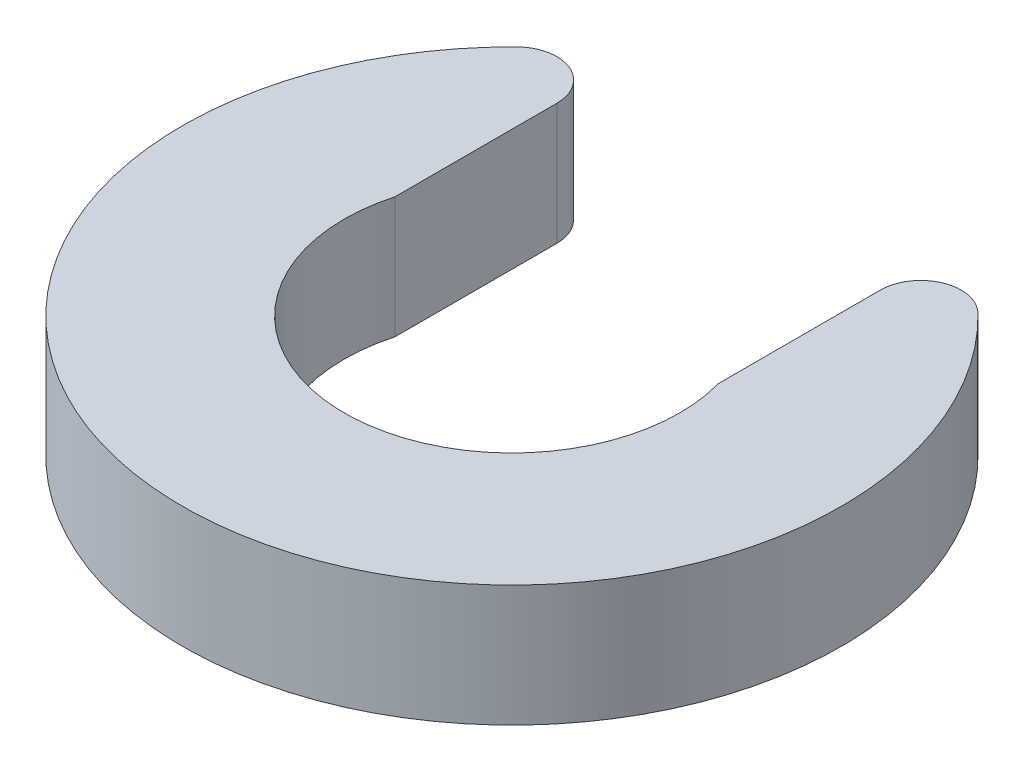
ISO-10303-21;
HEADER;
FILE_DESCRIPTION(('STEP AP214'),'2;1');
FILE_NAME('part.step','',(''),(''),'','','');
FILE_SCHEMA(('AUTOMOTIVE_DESIGN { 1 0 10303 214 1 1 1 1 }'));
ENDSEC;
DATA;
#1=APPLICATION_CONTEXT('core data for automotive mechanical design processes');
#2=APPLICATION_PROTOCOL_DEFINITION('international standard','automotive_design',2000,#1);
#3=PRODUCT_CONTEXT('',#1,'mechanical');
#4=PRODUCT('Part','Part','',(#3));
#5=PRODUCT_RELATED_PRODUCT_CATEGORY('part','',(#4));
#6=PRODUCT_DEFINITION_FORMATION('','',#4);
#7=PRODUCT_DEFINITION_CONTEXT('part definition',#1,'design');
#8=PRODUCT_DEFINITION('design','',#6,#7);
#9=PRODUCT_DEFINITION_SHAPE('','',#8);
#10=(LENGTH_UNIT() NAMED_UNIT(*) SI_UNIT(.MILLI.,.METRE.));
#11=(NAMED_UNIT(*) PLANE_ANGLE_UNIT() SI_UNIT($,.RADIAN.));
#12=(NAMED_UNIT(*) SI_UNIT($,.STERADIAN.) SOLID_ANGLE_UNIT());
#13=UNCERTAINTY_MEASURE_WITH_UNIT(LENGTH_MEASURE(1.E-05),#10,'distance_accuracy_value','');
#14=(GEOMETRIC_REPRESENTATION_CONTEXT(3) GLOBAL_UNCERTAINTY_ASSIGNED_CONTEXT((#13)) GLOBAL_UNIT_ASSIGNED_CONTEXT((#10,
#11,#12)) REPRESENTATION_CONTEXT('',''));
#15=CARTESIAN_POINT('',(0.,0.,0.));
#16=DIRECTION('',(0.,0.,1.));
#17=DIRECTION('',(1.,0.,0.));
#18=AXIS2_PLACEMENT_3D('',#15,#16,#17);
#19=CARTESIAN_POINT('',(-4.,3.,0.));
#20=DIRECTION('',(1.,0.,0.));
#21=DIRECTION('',(0.,0.,-1.));
#22=AXIS2_PLACEMENT_3D('',#19,#20,#21);
#23=PLANE('',#22);
#24=DIRECTION('',(0.,0.,1.));
#25=VECTOR('',#24,1.);
#26=CARTESIAN_POINT('',(-4.,0.,0.));
#27=LINE('',#26,#25);
#28=CARTESIAN_POINT('',(-4.,0.,-5.11101751122025));
#29=VERTEX_POINT('',#28);
#30=CARTESIAN_POINT('',(-4.,0.,-1.1056672193748));
#31=VERTEX_POINT('',#30);
#32=EDGE_CURVE('E117',#29,#31,#27,.T.);
#33=ORIENTED_EDGE('',*,*,#32,.F.);
#34=DIRECTION('',(0.,1.,0.));
#35=VECTOR('',#34,1.);
#36=CARTESIAN_POINT('',(-4.,3.,-5.11101751122025));
#37=LINE('',#36,#35);
#38=CARTESIAN_POINT('',(-4.,3.,-5.11101751122025));
#39=VERTEX_POINT('',#38);
#40=EDGE_CURVE('E11',#29,#39,#37,.T.);
#41=ORIENTED_EDGE('',*,*,#40,.T.);
#42=DIRECTION('',(0.,0.,1.));
#43=VECTOR('',#42,1.);
#44=CARTESIAN_POINT('',(-4.,3.,0.));
#45=LINE('',#44,#43);
#46=CARTESIAN_POINT('',(-4.,3.,-1.1056672193748));
#47=VERTEX_POINT('',#46);
#48=EDGE_CURVE('E123',#39,#47,#45,.T.);
#49=ORIENTED_EDGE('',*,*,#48,.T.);
#50=DIRECTION('',(0.,-1.,0.));
#51=VECTOR('',#50,1.);
#52=CARTESIAN_POINT('',(-4.,3.,-1.1056672193748));
#53=LINE('',#52,#51);
#54=EDGE_CURVE('E108',#47,#31,#53,.T.);
#55=ORIENTED_EDGE('',*,*,#54,.T.);
#56=EDGE_LOOP('',(#33,#41,#49,#55));
#57=FACE_BOUND('',#56,.T.);
#58=ADVANCED_FACE('F34',(#57),#23,.T.);
#59=CARTESIAN_POINT('',(0.,3.,0.));
#60=DIRECTION('',(0.,-1.,0.));
#61=DIRECTION('',(0.,0.,-1.));
#62=AXIS2_PLACEMENT_3D('',#59,#60,#61);
#63=CYLINDRICAL_SURFACE('',#62,8.15);
#64=CARTESIAN_POINT('',(0.,0.,0.));
#65=DIRECTION('',(0.,1.,0.));
#66=DIRECTION('',(0.,0.,1.));
#67=AXIS2_PLACEMENT_3D('',#64,#65,#66);
#68=CIRCLE('',#67,8.15);
#69=CARTESIAN_POINT('',(-5.6993006993007,0.,-5.82584513516713));
#70=VERTEX_POINT('',#69);
#71=CARTESIAN_POINT('',(5.6993006993007,0.,-5.82584513516713));
#72=VERTEX_POINT('',#71);
#73=EDGE_CURVE('E119',#70,#72,#68,.T.);
#74=ORIENTED_EDGE('',*,*,#73,.T.);
#75=DIRECTION('',(0.,-1.,0.));
#76=VECTOR('',#75,1.);
#77=CARTESIAN_POINT('',(5.6993006993007,3.,-5.82584513516714));
#78=LINE('',#77,#76);
#79=CARTESIAN_POINT('',(5.6993006993007,3.,-5.82584513516713));
#80=VERTEX_POINT('',#79);
#81=EDGE_CURVE('E55',#72,#80,#78,.F.);
#82=ORIENTED_EDGE('',*,*,#81,.T.);
#83=CARTESIAN_POINT('',(0.,3.,0.));
#84=DIRECTION('',(0.,1.,0.));
#85=DIRECTION('',(0.,0.,1.));
#86=AXIS2_PLACEMENT_3D('',#83,#84,#85);
#87=CIRCLE('',#86,8.15);
#88=CARTESIAN_POINT('',(-5.6993006993007,3.,-5.82584513516713));
#89=VERTEX_POINT('',#88);
#90=EDGE_CURVE('E97',#89,#80,#87,.T.);
#91=ORIENTED_EDGE('',*,*,#90,.F.);
#92=DIRECTION('',(0.,-1.,0.));
#93=VECTOR('',#92,1.);
#94=CARTESIAN_POINT('',(-5.6993006993007,3.,-5.82584513516714));
#95=LINE('',#94,#93);
#96=EDGE_CURVE('E130',#89,#70,#95,.T.);
#97=ORIENTED_EDGE('',*,*,#96,.T.);
#98=EDGE_LOOP('',(#74,#82,#91,#97));
#99=FACE_BOUND('',#98,.T.);
#100=ADVANCED_FACE('F138',(#99),#63,.T.);
#101=CARTESIAN_POINT('',(4.,3.,0.));
#102=DIRECTION('',(1.,0.,0.));
#103=DIRECTION('',(0.,0.,-1.));
#104=AXIS2_PLACEMENT_3D('',#101,#102,#103);
#105=PLANE('',#104);
#106=DIRECTION('',(0.,0.,1.));
#107=VECTOR('',#106,1.);
#108=CARTESIAN_POINT('',(4.,3.,0.));
#109=LINE('',#108,#107);
#110=CARTESIAN_POINT('',(4.,3.,-5.11101751122025));
#111=VERTEX_POINT('',#110);
#112=CARTESIAN_POINT('',(4.,3.,-1.1056672193748));
#113=VERTEX_POINT('',#112);
#114=EDGE_CURVE('E88',#111,#113,#109,.T.);
#115=ORIENTED_EDGE('',*,*,#114,.F.);
#116=DIRECTION('',(0.,-1.,0.));
#117=VECTOR('',#116,1.);
#118=CARTESIAN_POINT('',(4.,3.,-5.11101751122025));
#119=LINE('',#118,#117);
#120=CARTESIAN_POINT('',(4.,0.,-5.11101751122025));
#121=VERTEX_POINT('',#120);
#122=EDGE_CURVE('E107',#111,#121,#119,.T.);
#123=ORIENTED_EDGE('',*,*,#122,.T.);
#124=DIRECTION('',(0.,0.,1.));
#125=VECTOR('',#124,1.);
#126=CARTESIAN_POINT('',(4.,0.,0.));
#127=LINE('',#126,#125);
#128=CARTESIAN_POINT('',(4.,0.,-1.1056672193748));
#129=VERTEX_POINT('',#128);
#130=EDGE_CURVE('E103',#121,#129,#127,.T.);
#131=ORIENTED_EDGE('',*,*,#130,.T.);
#132=DIRECTION('',(0.,-1.,0.));
#133=VECTOR('',#132,1.);
#134=CARTESIAN_POINT('',(4.,3.,-1.1056672193748));
#135=LINE('',#134,#133);
#136=EDGE_CURVE('E100',#113,#129,#135,.T.);
#137=ORIENTED_EDGE('',*,*,#136,.F.);
#138=EDGE_LOOP('',(#115,#123,#131,#137));
#139=FACE_BOUND('',#138,.T.);
#140=ADVANCED_FACE('F101',(#139),#105,.F.);
#141=CARTESIAN_POINT('',(0.,3.,0.));
#142=DIRECTION('',(0.,-1.,0.));
#143=DIRECTION('',(0.,0.,-1.));
#144=AXIS2_PLACEMENT_3D('',#141,#142,#143);
#145=CYLINDRICAL_SURFACE('',#144,4.15);
#146=CARTESIAN_POINT('',(0.,0.,0.));
#147=DIRECTION('',(0.,1.,0.));
#148=DIRECTION('',(0.,0.,1.));
#149=AXIS2_PLACEMENT_3D('',#146,#147,#148);
#150=CIRCLE('',#149,4.15);
#151=EDGE_CURVE('E122',#31,#129,#150,.T.);
#152=ORIENTED_EDGE('',*,*,#151,.F.);
#153=ORIENTED_EDGE('',*,*,#54,.F.);
#154=CARTESIAN_POINT('',(0.,3.,0.));
#155=DIRECTION('',(0.,1.,0.));
#156=DIRECTION('',(0.,0.,1.));
#157=AXIS2_PLACEMENT_3D('',#154,#155,#156);
#158=CIRCLE('',#157,4.15);
#159=EDGE_CURVE('E92',#47,#113,#158,.T.);
#160=ORIENTED_EDGE('',*,*,#159,.T.);
#161=ORIENTED_EDGE('',*,*,#136,.T.);
#162=EDGE_LOOP('',(#152,#153,#160,#161));
#163=FACE_BOUND('',#162,.T.);
#164=ADVANCED_FACE('F111',(#163),#145,.F.);
#165=CARTESIAN_POINT('',(0.,3.,0.));
#166=DIRECTION('',(0.,1.,0.));
#167=DIRECTION('',(0.,0.,1.));
#168=AXIS2_PLACEMENT_3D('',#165,#166,#167);
#169=PLANE('',#168);
#170=ORIENTED_EDGE('',*,*,#90,.T.);
#171=CARTESIAN_POINT('',(5.,3.,-5.11101751122025));
#172=DIRECTION('',(0.,1.,0.));
#173=DIRECTION('',(0.,0.,1.));
#174=AXIS2_PLACEMENT_3D('',#171,#172,#173);
#175=CIRCLE('',#174,1.);
#176=EDGE_CURVE('E42',#80,#111,#175,.T.);
#177=ORIENTED_EDGE('',*,*,#176,.T.);
#178=ORIENTED_EDGE('',*,*,#114,.T.);
#179=ORIENTED_EDGE('',*,*,#159,.F.);
#180=ORIENTED_EDGE('',*,*,#48,.F.);
#181=CARTESIAN_POINT('',(-5.,3.,-5.11101751122025));
#182=DIRECTION('',(0.,1.,0.));
#183=DIRECTION('',(0.,0.,1.));
#184=AXIS2_PLACEMENT_3D('',#181,#182,#183);
#185=CIRCLE('',#184,1.);
#186=EDGE_CURVE('E134',#39,#89,#185,.T.);
#187=ORIENTED_EDGE('',*,*,#186,.T.);
#188=EDGE_LOOP('',(#170,#177,#178,#179,#180,#187));
#189=FACE_BOUND('',#188,.T.);
#190=ADVANCED_FACE('F90',(#189),#169,.T.);
#191=CARTESIAN_POINT('',(0.,0.,0.));
#192=DIRECTION('',(0.,1.,0.));
#193=DIRECTION('',(0.,0.,1.));
#194=AXIS2_PLACEMENT_3D('',#191,#192,#193);
#195=PLANE('',#194);
#196=ORIENTED_EDGE('',*,*,#130,.F.);
#197=CARTESIAN_POINT('',(5.,0.,-5.11101751122025));
#198=DIRECTION('',(0.,1.,0.));
#199=DIRECTION('',(0.,0.,1.));
#200=AXIS2_PLACEMENT_3D('',#197,#198,#199);
#201=CIRCLE('',#200,1.);
#202=EDGE_CURVE('E128',#121,#72,#201,.F.);
#203=ORIENTED_EDGE('',*,*,#202,.T.);
#204=ORIENTED_EDGE('',*,*,#73,.F.);
#205=CARTESIAN_POINT('',(-5.,0.,-5.11101751122025));
#206=DIRECTION('',(0.,1.,0.));
#207=DIRECTION('',(0.,0.,1.));
#208=AXIS2_PLACEMENT_3D('',#205,#206,#207);
#209=CIRCLE('',#208,1.);
#210=EDGE_CURVE('E126',#70,#29,#209,.F.);
#211=ORIENTED_EDGE('',*,*,#210,.T.);
#212=ORIENTED_EDGE('',*,*,#32,.T.);
#213=ORIENTED_EDGE('',*,*,#151,.T.);
#214=EDGE_LOOP('',(#196,#203,#204,#211,#212,#213));
#215=FACE_BOUND('',#214,.T.);
#216=ADVANCED_FACE('F141',(#215),#195,.F.);
#217=CARTESIAN_POINT('',(5.,3.,-5.11101751122025));
#218=DIRECTION('',(0.,-1.,0.));
#219=DIRECTION('',(0.,0.,-1.));
#220=AXIS2_PLACEMENT_3D('',#217,#218,#219);
#221=CYLINDRICAL_SURFACE('',#220,1.);
#222=ORIENTED_EDGE('',*,*,#176,.F.);
#223=ORIENTED_EDGE('',*,*,#81,.F.);
#224=ORIENTED_EDGE('',*,*,#202,.F.);
#225=ORIENTED_EDGE('',*,*,#122,.F.);
#226=EDGE_LOOP('',(#222,#223,#224,#225));
#227=FACE_BOUND('',#226,.T.);
#228=ADVANCED_FACE('F143',(#227),#221,.T.);
#229=CARTESIAN_POINT('',(-5.,3.,-5.11101751122025));
#230=DIRECTION('',(0.,-1.,0.));
#231=DIRECTION('',(0.,0.,-1.));
#232=AXIS2_PLACEMENT_3D('',#229,#230,#231);
#233=CYLINDRICAL_SURFACE('',#232,1.);
#234=ORIENTED_EDGE('',*,*,#186,.F.);
#235=ORIENTED_EDGE('',*,*,#40,.F.);
#236=ORIENTED_EDGE('',*,*,#210,.F.);
#237=ORIENTED_EDGE('',*,*,#96,.F.);
#238=EDGE_LOOP('',(#234,#235,#236,#237));
#239=FACE_BOUND('',#238,.T.);
#240=ADVANCED_FACE('F36',(#239),#233,.T.);
#241=CLOSED_SHELL('',(#58,#100,#140,#164,#190,#216,#228,#240));
#242=MANIFOLD_SOLID_BREP('B2',#241);
#243=ADVANCED_BREP_SHAPE_REPRESENTATION('',(#18,#242),#14);
#244=SHAPE_DEFINITION_REPRESENTATION(#9,#243);
ENDSEC;
END-ISO-10303-21;
